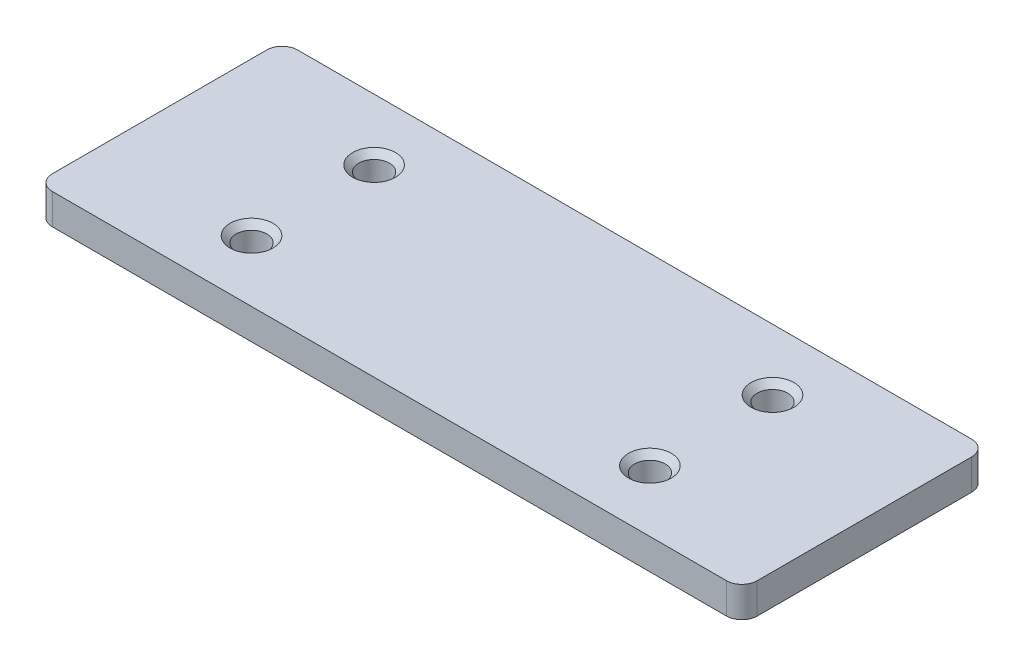
ISO-10303-21;
HEADER;
FILE_DESCRIPTION(('STEP AP214'),'2;1');
FILE_NAME('part.step','',(''),(''),'','','');
FILE_SCHEMA(('AUTOMOTIVE_DESIGN { 1 0 10303 214 1 1 1 1 }'));
ENDSEC;
DATA;
#1=APPLICATION_CONTEXT('core data for automotive mechanical design processes');
#2=APPLICATION_PROTOCOL_DEFINITION('international standard','automotive_design',2000,#1);
#3=PRODUCT_CONTEXT('',#1,'mechanical');
#4=PRODUCT('Part','Part','',(#3));
#5=PRODUCT_RELATED_PRODUCT_CATEGORY('part','',(#4));
#6=PRODUCT_DEFINITION_FORMATION('','',#4);
#7=PRODUCT_DEFINITION_CONTEXT('part definition',#1,'design');
#8=PRODUCT_DEFINITION('design','',#6,#7);
#9=PRODUCT_DEFINITION_SHAPE('','',#8);
#10=(LENGTH_UNIT() NAMED_UNIT(*) SI_UNIT(.MILLI.,.METRE.));
#11=(NAMED_UNIT(*) PLANE_ANGLE_UNIT() SI_UNIT($,.RADIAN.));
#12=(NAMED_UNIT(*) SI_UNIT($,.STERADIAN.) SOLID_ANGLE_UNIT());
#13=UNCERTAINTY_MEASURE_WITH_UNIT(LENGTH_MEASURE(1.E-05),#10,'distance_accuracy_value','');
#14=(GEOMETRIC_REPRESENTATION_CONTEXT(3) GLOBAL_UNCERTAINTY_ASSIGNED_CONTEXT((#13)) GLOBAL_UNIT_ASSIGNED_CONTEXT((#10,
#11,#12)) REPRESENTATION_CONTEXT('',''));
#15=CARTESIAN_POINT('',(0.,0.,0.));
#16=DIRECTION('',(0.,0.,1.));
#17=DIRECTION('',(1.,0.,0.));
#18=AXIS2_PLACEMENT_3D('',#15,#16,#17);
#19=CARTESIAN_POINT('',(0.,5.,0.));
#20=DIRECTION('',(0.,-1.,0.));
#21=DIRECTION('',(0.,0.,-1.));
#22=AXIS2_PLACEMENT_3D('',#19,#20,#21);
#23=PLANE('',#22);
#24=CARTESIAN_POINT('',(32.4999999999999,5.,10.0000000000001));
#25=DIRECTION('',(0.,-1.,0.));
#26=DIRECTION('',(0.,0.,-1.));
#27=AXIS2_PLACEMENT_3D('',#24,#25,#26);
#28=CIRCLE('',#27,3.50000000000003);
#29=CARTESIAN_POINT('',(32.4999999999999,5.,6.5000000000001));
#30=VERTEX_POINT('',#29);
#31=EDGE_CURVE('E220',#30,#30,#28,.T.);
#32=ORIENTED_EDGE('',*,*,#31,.T.);
#33=EDGE_LOOP('',(#32));
#34=FACE_BOUND('',#33,.T.);
#35=CARTESIAN_POINT('',(32.5,5.,-9.99999999999987));
#36=DIRECTION('',(0.,-1.,0.));
#37=DIRECTION('',(0.,0.,-1.));
#38=AXIS2_PLACEMENT_3D('',#35,#36,#37);
#39=CIRCLE('',#38,3.50000000000003);
#40=CARTESIAN_POINT('',(32.5,5.,-13.4999999999999));
#41=VERTEX_POINT('',#40);
#42=EDGE_CURVE('E216',#41,#41,#39,.T.);
#43=ORIENTED_EDGE('',*,*,#42,.T.);
#44=EDGE_LOOP('',(#43));
#45=FACE_BOUND('',#44,.T.);
#46=CARTESIAN_POINT('',(-32.5,5.,10.));
#47=DIRECTION('',(0.,-1.,0.));
#48=DIRECTION('',(0.,0.,-1.));
#49=AXIS2_PLACEMENT_3D('',#46,#47,#48);
#50=CIRCLE('',#49,3.50000000000003);
#51=CARTESIAN_POINT('',(-32.5,5.,6.49999999999997));
#52=VERTEX_POINT('',#51);
#53=EDGE_CURVE('E212',#52,#52,#50,.T.);
#54=ORIENTED_EDGE('',*,*,#53,.T.);
#55=EDGE_LOOP('',(#54));
#56=FACE_BOUND('',#55,.T.);
#57=CARTESIAN_POINT('',(-32.5,5.,-10.));
#58=DIRECTION('',(0.,-1.,0.));
#59=DIRECTION('',(0.,0.,-1.));
#60=AXIS2_PLACEMENT_3D('',#57,#58,#59);
#61=CIRCLE('',#60,3.50000000000003);
#62=CARTESIAN_POINT('',(-32.5,5.,-13.5));
#63=VERTEX_POINT('',#62);
#64=EDGE_CURVE('E208',#63,#63,#61,.T.);
#65=ORIENTED_EDGE('',*,*,#64,.T.);
#66=EDGE_LOOP('',(#65));
#67=FACE_BOUND('',#66,.T.);
#68=DIRECTION('',(1.,0.,0.));
#69=VECTOR('',#68,1.);
#70=CARTESIAN_POINT('',(-57.5,5.,20.));
#71=LINE('',#70,#69);
#72=CARTESIAN_POINT('',(-55.,5.,20.));
#73=VERTEX_POINT('',#72);
#74=CARTESIAN_POINT('',(55.,5.,20.));
#75=VERTEX_POINT('',#74);
#76=EDGE_CURVE('E159',#73,#75,#71,.T.);
#77=ORIENTED_EDGE('',*,*,#76,.T.);
#78=CARTESIAN_POINT('',(55.,5.,17.5));
#79=DIRECTION('',(0.,-1.,0.));
#80=DIRECTION('',(0.,0.,-1.));
#81=AXIS2_PLACEMENT_3D('',#78,#79,#80);
#82=CIRCLE('',#81,2.5);
#83=CARTESIAN_POINT('',(57.5,5.,17.5));
#84=VERTEX_POINT('',#83);
#85=EDGE_CURVE('E188',#75,#84,#82,.F.);
#86=ORIENTED_EDGE('',*,*,#85,.T.);
#87=DIRECTION('',(0.,0.,-1.));
#88=VECTOR('',#87,1.);
#89=CARTESIAN_POINT('',(57.5,5.,20.));
#90=LINE('',#89,#88);
#91=CARTESIAN_POINT('',(57.5,5.,-17.5));
#92=VERTEX_POINT('',#91);
#93=EDGE_CURVE('E137',#84,#92,#90,.T.);
#94=ORIENTED_EDGE('',*,*,#93,.T.);
#95=CARTESIAN_POINT('',(55.,5.,-17.5));
#96=DIRECTION('',(0.,-1.,0.));
#97=DIRECTION('',(0.,0.,-1.));
#98=AXIS2_PLACEMENT_3D('',#95,#96,#97);
#99=CIRCLE('',#98,2.5);
#100=CARTESIAN_POINT('',(55.,5.,-20.));
#101=VERTEX_POINT('',#100);
#102=EDGE_CURVE('E183',#92,#101,#99,.F.);
#103=ORIENTED_EDGE('',*,*,#102,.T.);
#104=DIRECTION('',(-1.,0.,0.));
#105=VECTOR('',#104,1.);
#106=CARTESIAN_POINT('',(-57.5,5.,-20.));
#107=LINE('',#106,#105);
#108=CARTESIAN_POINT('',(-55.,5.,-20.));
#109=VERTEX_POINT('',#108);
#110=EDGE_CURVE('E326',#101,#109,#107,.T.);
#111=ORIENTED_EDGE('',*,*,#110,.T.);
#112=CARTESIAN_POINT('',(-55.,5.,-17.5));
#113=DIRECTION('',(0.,-1.,0.));
#114=DIRECTION('',(0.,0.,-1.));
#115=AXIS2_PLACEMENT_3D('',#112,#113,#114);
#116=CIRCLE('',#115,2.5);
#117=CARTESIAN_POINT('',(-57.5,5.,-17.5));
#118=VERTEX_POINT('',#117);
#119=EDGE_CURVE('E71',#109,#118,#116,.F.);
#120=ORIENTED_EDGE('',*,*,#119,.T.);
#121=DIRECTION('',(0.,0.,1.));
#122=VECTOR('',#121,1.);
#123=CARTESIAN_POINT('',(-57.5,5.,20.));
#124=LINE('',#123,#122);
#125=CARTESIAN_POINT('',(-57.5,5.,17.5));
#126=VERTEX_POINT('',#125);
#127=EDGE_CURVE('E328',#118,#126,#124,.T.);
#128=ORIENTED_EDGE('',*,*,#127,.T.);
#129=CARTESIAN_POINT('',(-55.,5.,17.5));
#130=DIRECTION('',(0.,-1.,0.));
#131=DIRECTION('',(0.,0.,-1.));
#132=AXIS2_PLACEMENT_3D('',#129,#130,#131);
#133=CIRCLE('',#132,2.5);
#134=EDGE_CURVE('E180',#126,#73,#133,.F.);
#135=ORIENTED_EDGE('',*,*,#134,.T.);
#136=EDGE_LOOP('',(#77,#86,#94,#103,#111,#120,#128,#135));
#137=FACE_BOUND('',#136,.T.);
#138=ADVANCED_FACE('F47',(#34,#45,#56,#67,#137),#23,.F.);
#139=CARTESIAN_POINT('',(0.,0.,0.));
#140=DIRECTION('',(0.,-1.,0.));
#141=DIRECTION('',(0.,0.,-1.));
#142=AXIS2_PLACEMENT_3D('',#139,#140,#141);
#143=PLANE('',#142);
#144=CARTESIAN_POINT('',(32.4999999999999,0.,10.0000000000001));
#145=DIRECTION('',(0.,1.,0.));
#146=DIRECTION('',(0.,0.,-1.));
#147=AXIS2_PLACEMENT_3D('',#144,#145,#146);
#148=CIRCLE('',#147,2.5);
#149=CARTESIAN_POINT('',(32.4999999999999,0.,7.50000000000013));
#150=VERTEX_POINT('',#149);
#151=EDGE_CURVE('E313',#150,#150,#148,.T.);
#152=ORIENTED_EDGE('',*,*,#151,.T.);
#153=EDGE_LOOP('',(#152));
#154=FACE_BOUND('',#153,.T.);
#155=CARTESIAN_POINT('',(-32.5,0.,-10.));
#156=DIRECTION('',(0.,1.,0.));
#157=DIRECTION('',(0.,0.,1.));
#158=AXIS2_PLACEMENT_3D('',#155,#156,#157);
#159=CIRCLE('',#158,2.5);
#160=CARTESIAN_POINT('',(-32.5,0.,-7.5));
#161=VERTEX_POINT('',#160);
#162=EDGE_CURVE('E148',#161,#161,#159,.T.);
#163=ORIENTED_EDGE('',*,*,#162,.T.);
#164=EDGE_LOOP('',(#163));
#165=FACE_BOUND('',#164,.T.);
#166=DIRECTION('',(0.,0.,-1.));
#167=VECTOR('',#166,1.);
#168=CARTESIAN_POINT('',(57.5,0.,20.));
#169=LINE('',#168,#167);
#170=CARTESIAN_POINT('',(57.5,0.,17.5));
#171=VERTEX_POINT('',#170);
#172=CARTESIAN_POINT('',(57.5,0.,-17.5));
#173=VERTEX_POINT('',#172);
#174=EDGE_CURVE('E134',#171,#173,#169,.T.);
#175=ORIENTED_EDGE('',*,*,#174,.F.);
#176=CARTESIAN_POINT('',(55.,0.,17.5));
#177=DIRECTION('',(0.,-1.,0.));
#178=DIRECTION('',(0.,0.,-1.));
#179=AXIS2_PLACEMENT_3D('',#176,#177,#178);
#180=CIRCLE('',#179,2.5);
#181=CARTESIAN_POINT('',(55.,0.,20.));
#182=VERTEX_POINT('',#181);
#183=EDGE_CURVE('E116',#171,#182,#180,.T.);
#184=ORIENTED_EDGE('',*,*,#183,.T.);
#185=DIRECTION('',(1.,0.,0.));
#186=VECTOR('',#185,1.);
#187=CARTESIAN_POINT('',(-57.5,0.,20.));
#188=LINE('',#187,#186);
#189=CARTESIAN_POINT('',(-55.,0.,20.));
#190=VERTEX_POINT('',#189);
#191=EDGE_CURVE('E164',#190,#182,#188,.T.);
#192=ORIENTED_EDGE('',*,*,#191,.F.);
#193=CARTESIAN_POINT('',(-55.,0.,17.5));
#194=DIRECTION('',(0.,-1.,0.));
#195=DIRECTION('',(0.,0.,-1.));
#196=AXIS2_PLACEMENT_3D('',#193,#194,#195);
#197=CIRCLE('',#196,2.5);
#198=CARTESIAN_POINT('',(-57.5,0.,17.5));
#199=VERTEX_POINT('',#198);
#200=EDGE_CURVE('E139',#190,#199,#197,.T.);
#201=ORIENTED_EDGE('',*,*,#200,.T.);
#202=DIRECTION('',(0.,0.,1.));
#203=VECTOR('',#202,1.);
#204=CARTESIAN_POINT('',(-57.5,0.,20.));
#205=LINE('',#204,#203);
#206=CARTESIAN_POINT('',(-57.5,0.,-17.5));
#207=VERTEX_POINT('',#206);
#208=EDGE_CURVE('E153',#207,#199,#205,.T.);
#209=ORIENTED_EDGE('',*,*,#208,.F.);
#210=CARTESIAN_POINT('',(-55.,0.,-17.5));
#211=DIRECTION('',(0.,-1.,0.));
#212=DIRECTION('',(0.,0.,-1.));
#213=AXIS2_PLACEMENT_3D('',#210,#211,#212);
#214=CIRCLE('',#213,2.5);
#215=CARTESIAN_POINT('',(-55.,0.,-20.));
#216=VERTEX_POINT('',#215);
#217=EDGE_CURVE('E128',#207,#216,#214,.T.);
#218=ORIENTED_EDGE('',*,*,#217,.T.);
#219=DIRECTION('',(-1.,0.,0.));
#220=VECTOR('',#219,1.);
#221=CARTESIAN_POINT('',(-57.5,0.,-20.));
#222=LINE('',#221,#220);
#223=CARTESIAN_POINT('',(55.,0.,-20.));
#224=VERTEX_POINT('',#223);
#225=EDGE_CURVE('E147',#224,#216,#222,.T.);
#226=ORIENTED_EDGE('',*,*,#225,.F.);
#227=CARTESIAN_POINT('',(55.,0.,-17.5));
#228=DIRECTION('',(0.,-1.,0.));
#229=DIRECTION('',(0.,0.,-1.));
#230=AXIS2_PLACEMENT_3D('',#227,#228,#229);
#231=CIRCLE('',#230,2.5);
#232=EDGE_CURVE('E145',#224,#173,#231,.T.);
#233=ORIENTED_EDGE('',*,*,#232,.T.);
#234=EDGE_LOOP('',(#175,#184,#192,#201,#209,#218,#226,#233));
#235=FACE_BOUND('',#234,.T.);
#236=CARTESIAN_POINT('',(-32.5,0.,10.));
#237=DIRECTION('',(0.,1.,0.));
#238=DIRECTION('',(0.,0.,1.));
#239=AXIS2_PLACEMENT_3D('',#236,#237,#238);
#240=CIRCLE('',#239,2.5);
#241=CARTESIAN_POINT('',(-32.5,0.,12.5));
#242=VERTEX_POINT('',#241);
#243=EDGE_CURVE('E156',#242,#242,#240,.T.);
#244=ORIENTED_EDGE('',*,*,#243,.T.);
#245=EDGE_LOOP('',(#244));
#246=FACE_BOUND('',#245,.T.);
#247=CARTESIAN_POINT('',(32.5,0.,-9.99999999999987));
#248=DIRECTION('',(0.,1.,0.));
#249=DIRECTION('',(0.,0.,-1.));
#250=AXIS2_PLACEMENT_3D('',#247,#248,#249);
#251=CIRCLE('',#250,2.5);
#252=CARTESIAN_POINT('',(32.5,0.,-12.4999999999999));
#253=VERTEX_POINT('',#252);
#254=EDGE_CURVE('E315',#253,#253,#251,.T.);
#255=ORIENTED_EDGE('',*,*,#254,.T.);
#256=EDGE_LOOP('',(#255));
#257=FACE_BOUND('',#256,.T.);
#258=ADVANCED_FACE('F142',(#154,#165,#235,#246,#257),#143,.T.);
#259=CARTESIAN_POINT('',(57.5,5.,20.));
#260=DIRECTION('',(-1.,0.,0.));
#261=DIRECTION('',(0.,0.,1.));
#262=AXIS2_PLACEMENT_3D('',#259,#260,#261);
#263=PLANE('',#262);
#264=ORIENTED_EDGE('',*,*,#93,.F.);
#265=DIRECTION('',(0.,-1.,0.));
#266=VECTOR('',#265,1.);
#267=CARTESIAN_POINT('',(57.5,5.,17.5));
#268=LINE('',#267,#266);
#269=EDGE_CURVE('E120',#84,#171,#268,.T.);
#270=ORIENTED_EDGE('',*,*,#269,.T.);
#271=ORIENTED_EDGE('',*,*,#174,.T.);
#272=DIRECTION('',(0.,-1.,0.));
#273=VECTOR('',#272,1.);
#274=CARTESIAN_POINT('',(57.5,5.,-17.5));
#275=LINE('',#274,#273);
#276=EDGE_CURVE('E140',#173,#92,#275,.F.);
#277=ORIENTED_EDGE('',*,*,#276,.T.);
#278=EDGE_LOOP('',(#264,#270,#271,#277));
#279=FACE_BOUND('',#278,.T.);
#280=ADVANCED_FACE('F133',(#279),#263,.F.);
#281=CARTESIAN_POINT('',(-57.5,5.,-20.));
#282=DIRECTION('',(0.,0.,1.));
#283=DIRECTION('',(1.,0.,0.));
#284=AXIS2_PLACEMENT_3D('',#281,#282,#283);
#285=PLANE('',#284);
#286=ORIENTED_EDGE('',*,*,#225,.T.);
#287=DIRECTION('',(0.,-1.,0.));
#288=VECTOR('',#287,1.);
#289=CARTESIAN_POINT('',(-55.,5.,-20.));
#290=LINE('',#289,#288);
#291=EDGE_CURVE('E201',#216,#109,#290,.F.);
#292=ORIENTED_EDGE('',*,*,#291,.T.);
#293=ORIENTED_EDGE('',*,*,#110,.F.);
#294=DIRECTION('',(0.,-1.,0.));
#295=VECTOR('',#294,1.);
#296=CARTESIAN_POINT('',(55.,5.,-20.));
#297=LINE('',#296,#295);
#298=EDGE_CURVE('E197',#101,#224,#297,.T.);
#299=ORIENTED_EDGE('',*,*,#298,.T.);
#300=EDGE_LOOP('',(#286,#292,#293,#299));
#301=FACE_BOUND('',#300,.T.);
#302=ADVANCED_FACE('F268',(#301),#285,.F.);
#303=CARTESIAN_POINT('',(-57.5,5.,20.));
#304=DIRECTION('',(1.,0.,0.));
#305=DIRECTION('',(0.,0.,-1.));
#306=AXIS2_PLACEMENT_3D('',#303,#304,#305);
#307=PLANE('',#306);
#308=ORIENTED_EDGE('',*,*,#127,.F.);
#309=DIRECTION('',(0.,-1.,0.));
#310=VECTOR('',#309,1.);
#311=CARTESIAN_POINT('',(-57.5,5.,-17.5));
#312=LINE('',#311,#310);
#313=EDGE_CURVE('E193',#118,#207,#312,.T.);
#314=ORIENTED_EDGE('',*,*,#313,.T.);
#315=ORIENTED_EDGE('',*,*,#208,.T.);
#316=DIRECTION('',(0.,-1.,0.));
#317=VECTOR('',#316,1.);
#318=CARTESIAN_POINT('',(-57.5,5.,17.5));
#319=LINE('',#318,#317);
#320=EDGE_CURVE('E64',#199,#126,#319,.F.);
#321=ORIENTED_EDGE('',*,*,#320,.T.);
#322=EDGE_LOOP('',(#308,#314,#315,#321));
#323=FACE_BOUND('',#322,.T.);
#324=ADVANCED_FACE('F264',(#323),#307,.F.);
#325=CARTESIAN_POINT('',(-57.5,5.,20.));
#326=DIRECTION('',(0.,0.,-1.));
#327=DIRECTION('',(-1.,0.,0.));
#328=AXIS2_PLACEMENT_3D('',#325,#326,#327);
#329=PLANE('',#328);
#330=ORIENTED_EDGE('',*,*,#191,.T.);
#331=DIRECTION('',(0.,-1.,0.));
#332=VECTOR('',#331,1.);
#333=CARTESIAN_POINT('',(55.,5.,20.));
#334=LINE('',#333,#332);
#335=EDGE_CURVE('E121',#182,#75,#334,.F.);
#336=ORIENTED_EDGE('',*,*,#335,.T.);
#337=ORIENTED_EDGE('',*,*,#76,.F.);
#338=DIRECTION('',(0.,-1.,0.));
#339=VECTOR('',#338,1.);
#340=CARTESIAN_POINT('',(-55.,5.,20.));
#341=LINE('',#340,#339);
#342=EDGE_CURVE('E127',#73,#190,#341,.T.);
#343=ORIENTED_EDGE('',*,*,#342,.T.);
#344=EDGE_LOOP('',(#330,#336,#337,#343));
#345=FACE_BOUND('',#344,.T.);
#346=ADVANCED_FACE('F261',(#345),#329,.F.);
#347=CARTESIAN_POINT('',(-32.5,5.,-10.));
#348=DIRECTION('',(0.,-1.,0.));
#349=DIRECTION('',(0.,0.,-1.));
#350=AXIS2_PLACEMENT_3D('',#347,#348,#349);
#351=CYLINDRICAL_SURFACE('',#350,2.5);
#352=CARTESIAN_POINT('',(-32.5,3.99999999999997,-10.));
#353=DIRECTION('',(0.,-1.,0.));
#354=DIRECTION('',(0.,0.,-1.));
#355=AXIS2_PLACEMENT_3D('',#352,#353,#354);
#356=CIRCLE('',#355,2.5);
#357=CARTESIAN_POINT('',(-32.5,3.99999999999997,-12.5));
#358=VERTEX_POINT('',#357);
#359=EDGE_CURVE('E11',#358,#358,#356,.F.);
#360=ORIENTED_EDGE('',*,*,#359,.T.);
#361=EDGE_LOOP('',(#360));
#362=FACE_BOUND('',#361,.T.);
#363=ORIENTED_EDGE('',*,*,#162,.F.);
#364=EDGE_LOOP('',(#363));
#365=FACE_BOUND('',#364,.T.);
#366=ADVANCED_FACE('F258',(#362,#365),#351,.F.);
#367=CARTESIAN_POINT('',(-32.5,5.,10.));
#368=DIRECTION('',(0.,-1.,0.));
#369=DIRECTION('',(0.,0.,-1.));
#370=AXIS2_PLACEMENT_3D('',#367,#368,#369);
#371=CYLINDRICAL_SURFACE('',#370,2.5);
#372=CARTESIAN_POINT('',(-32.5,3.99999999999998,10.));
#373=DIRECTION('',(0.,-1.,0.));
#374=DIRECTION('',(0.,0.,-1.));
#375=AXIS2_PLACEMENT_3D('',#372,#373,#374);
#376=CIRCLE('',#375,2.5);
#377=CARTESIAN_POINT('',(-32.5,3.99999999999998,7.5));
#378=VERTEX_POINT('',#377);
#379=EDGE_CURVE('E57',#378,#378,#376,.F.);
#380=ORIENTED_EDGE('',*,*,#379,.T.);
#381=EDGE_LOOP('',(#380));
#382=FACE_BOUND('',#381,.T.);
#383=ORIENTED_EDGE('',*,*,#243,.F.);
#384=EDGE_LOOP('',(#383));
#385=FACE_BOUND('',#384,.T.);
#386=ADVANCED_FACE('F231',(#382,#385),#371,.F.);
#387=CARTESIAN_POINT('',(32.4999999999999,5.,10.0000000000001));
#388=DIRECTION('',(0.,-1.,0.));
#389=DIRECTION('',(0.,0.,-1.));
#390=AXIS2_PLACEMENT_3D('',#387,#388,#389);
#391=CYLINDRICAL_SURFACE('',#390,2.5);
#392=CARTESIAN_POINT('',(32.4999999999999,3.99999999999998,10.0000000000001));
#393=DIRECTION('',(0.,-1.,0.));
#394=DIRECTION('',(0.,0.,-1.));
#395=AXIS2_PLACEMENT_3D('',#392,#393,#394);
#396=CIRCLE('',#395,2.5);
#397=CARTESIAN_POINT('',(32.4999999999999,3.99999999999998,7.50000000000013));
#398=VERTEX_POINT('',#397);
#399=EDGE_CURVE('E204',#398,#398,#396,.F.);
#400=ORIENTED_EDGE('',*,*,#399,.T.);
#401=EDGE_LOOP('',(#400));
#402=FACE_BOUND('',#401,.T.);
#403=ORIENTED_EDGE('',*,*,#151,.F.);
#404=EDGE_LOOP('',(#403));
#405=FACE_BOUND('',#404,.T.);
#406=ADVANCED_FACE('F307',(#402,#405),#391,.F.);
#407=CARTESIAN_POINT('',(32.5,5.,-9.99999999999987));
#408=DIRECTION('',(0.,-1.,0.));
#409=DIRECTION('',(0.,0.,-1.));
#410=AXIS2_PLACEMENT_3D('',#407,#408,#409);
#411=CYLINDRICAL_SURFACE('',#410,2.5);
#412=CARTESIAN_POINT('',(32.5,3.99999999999998,-9.99999999999987));
#413=DIRECTION('',(0.,-1.,0.));
#414=DIRECTION('',(0.,0.,-1.));
#415=AXIS2_PLACEMENT_3D('',#412,#413,#414);
#416=CIRCLE('',#415,2.5);
#417=CARTESIAN_POINT('',(32.5,3.99999999999998,-12.4999999999999));
#418=VERTEX_POINT('',#417);
#419=EDGE_CURVE('E224',#418,#418,#416,.F.);
#420=ORIENTED_EDGE('',*,*,#419,.T.);
#421=EDGE_LOOP('',(#420));
#422=FACE_BOUND('',#421,.T.);
#423=ORIENTED_EDGE('',*,*,#254,.F.);
#424=EDGE_LOOP('',(#423));
#425=FACE_BOUND('',#424,.T.);
#426=ADVANCED_FACE('F277',(#422,#425),#411,.F.);
#427=CARTESIAN_POINT('',(55.,5.,17.5));
#428=DIRECTION('',(0.,-1.,0.));
#429=DIRECTION('',(0.,0.,-1.));
#430=AXIS2_PLACEMENT_3D('',#427,#428,#429);
#431=CYLINDRICAL_SURFACE('',#430,2.5);
#432=ORIENTED_EDGE('',*,*,#85,.F.);
#433=ORIENTED_EDGE('',*,*,#335,.F.);
#434=ORIENTED_EDGE('',*,*,#183,.F.);
#435=ORIENTED_EDGE('',*,*,#269,.F.);
#436=EDGE_LOOP('',(#432,#433,#434,#435));
#437=FACE_BOUND('',#436,.T.);
#438=ADVANCED_FACE('F119',(#437),#431,.T.);
#439=CARTESIAN_POINT('',(-55.,5.,-17.5));
#440=DIRECTION('',(0.,-1.,0.));
#441=DIRECTION('',(0.,0.,-1.));
#442=AXIS2_PLACEMENT_3D('',#439,#440,#441);
#443=CYLINDRICAL_SURFACE('',#442,2.5);
#444=ORIENTED_EDGE('',*,*,#119,.F.);
#445=ORIENTED_EDGE('',*,*,#291,.F.);
#446=ORIENTED_EDGE('',*,*,#217,.F.);
#447=ORIENTED_EDGE('',*,*,#313,.F.);
#448=EDGE_LOOP('',(#444,#445,#446,#447));
#449=FACE_BOUND('',#448,.T.);
#450=ADVANCED_FACE('F276',(#449),#443,.T.);
#451=CARTESIAN_POINT('',(55.,5.,-17.5));
#452=DIRECTION('',(0.,-1.,0.));
#453=DIRECTION('',(0.,0.,-1.));
#454=AXIS2_PLACEMENT_3D('',#451,#452,#453);
#455=CYLINDRICAL_SURFACE('',#454,2.5);
#456=ORIENTED_EDGE('',*,*,#102,.F.);
#457=ORIENTED_EDGE('',*,*,#276,.F.);
#458=ORIENTED_EDGE('',*,*,#232,.F.);
#459=ORIENTED_EDGE('',*,*,#298,.F.);
#460=EDGE_LOOP('',(#456,#457,#458,#459));
#461=FACE_BOUND('',#460,.T.);
#462=ADVANCED_FACE('F280',(#461),#455,.T.);
#463=CARTESIAN_POINT('',(-55.,5.,17.5));
#464=DIRECTION('',(0.,-1.,0.));
#465=DIRECTION('',(0.,0.,-1.));
#466=AXIS2_PLACEMENT_3D('',#463,#464,#465);
#467=CYLINDRICAL_SURFACE('',#466,2.5);
#468=ORIENTED_EDGE('',*,*,#134,.F.);
#469=ORIENTED_EDGE('',*,*,#320,.F.);
#470=ORIENTED_EDGE('',*,*,#200,.F.);
#471=ORIENTED_EDGE('',*,*,#342,.F.);
#472=EDGE_LOOP('',(#468,#469,#470,#471));
#473=FACE_BOUND('',#472,.T.);
#474=ADVANCED_FACE('F284',(#473),#467,.T.);
#475=CARTESIAN_POINT('',(32.4999999999999,3.99999999999998,10.0000000000001));
#476=DIRECTION('',(0.,1.,0.));
#477=DIRECTION('',(0.,0.,1.));
#478=AXIS2_PLACEMENT_3D('',#475,#476,#477);
#479=CONICAL_SURFACE('',#478,2.5,0.785398163397451);
#480=ORIENTED_EDGE('',*,*,#31,.F.);
#481=EDGE_LOOP('',(#480));
#482=FACE_BOUND('',#481,.T.);
#483=ORIENTED_EDGE('',*,*,#399,.F.);
#484=EDGE_LOOP('',(#483));
#485=FACE_BOUND('',#484,.T.);
#486=ADVANCED_FACE('F243',(#482,#485),#479,.F.);
#487=CARTESIAN_POINT('',(32.5,3.99999999999998,-9.99999999999987));
#488=DIRECTION('',(0.,1.,0.));
#489=DIRECTION('',(0.,0.,1.));
#490=AXIS2_PLACEMENT_3D('',#487,#488,#489);
#491=CONICAL_SURFACE('',#490,2.5,0.785398163397451);
#492=ORIENTED_EDGE('',*,*,#42,.F.);
#493=EDGE_LOOP('',(#492));
#494=FACE_BOUND('',#493,.T.);
#495=ORIENTED_EDGE('',*,*,#419,.F.);
#496=EDGE_LOOP('',(#495));
#497=FACE_BOUND('',#496,.T.);
#498=ADVANCED_FACE('F236',(#494,#497),#491,.F.);
#499=CARTESIAN_POINT('',(-32.5,3.99999999999998,10.));
#500=DIRECTION('',(0.,1.,0.));
#501=DIRECTION('',(0.,0.,1.));
#502=AXIS2_PLACEMENT_3D('',#499,#500,#501);
#503=CONICAL_SURFACE('',#502,2.5,0.785398163397451);
#504=ORIENTED_EDGE('',*,*,#53,.F.);
#505=EDGE_LOOP('',(#504));
#506=FACE_BOUND('',#505,.T.);
#507=ORIENTED_EDGE('',*,*,#379,.F.);
#508=EDGE_LOOP('',(#507));
#509=FACE_BOUND('',#508,.T.);
#510=ADVANCED_FACE('F234',(#506,#509),#503,.F.);
#511=CARTESIAN_POINT('',(-32.5,3.99999999999997,-10.));
#512=DIRECTION('',(0.,1.,0.));
#513=DIRECTION('',(0.,0.,1.));
#514=AXIS2_PLACEMENT_3D('',#511,#512,#513);
#515=CONICAL_SURFACE('',#514,2.5,0.785398163397451);
#516=ORIENTED_EDGE('',*,*,#64,.F.);
#517=EDGE_LOOP('',(#516));
#518=FACE_BOUND('',#517,.T.);
#519=ORIENTED_EDGE('',*,*,#359,.F.);
#520=EDGE_LOOP('',(#519));
#521=FACE_BOUND('',#520,.T.);
#522=ADVANCED_FACE('F50',(#518,#521),#515,.F.);
#523=CLOSED_SHELL('',(#138,#258,#280,#302,#324,#346,#366,#386,#406,#426,#438,#450,#462,#474,
#486,#498,#510,#522));
#524=MANIFOLD_SOLID_BREP('B2',#523);
#525=ADVANCED_BREP_SHAPE_REPRESENTATION('',(#18,#524),#14);
#526=SHAPE_DEFINITION_REPRESENTATION(#9,#525);
ENDSEC;
END-ISO-10303-21;
